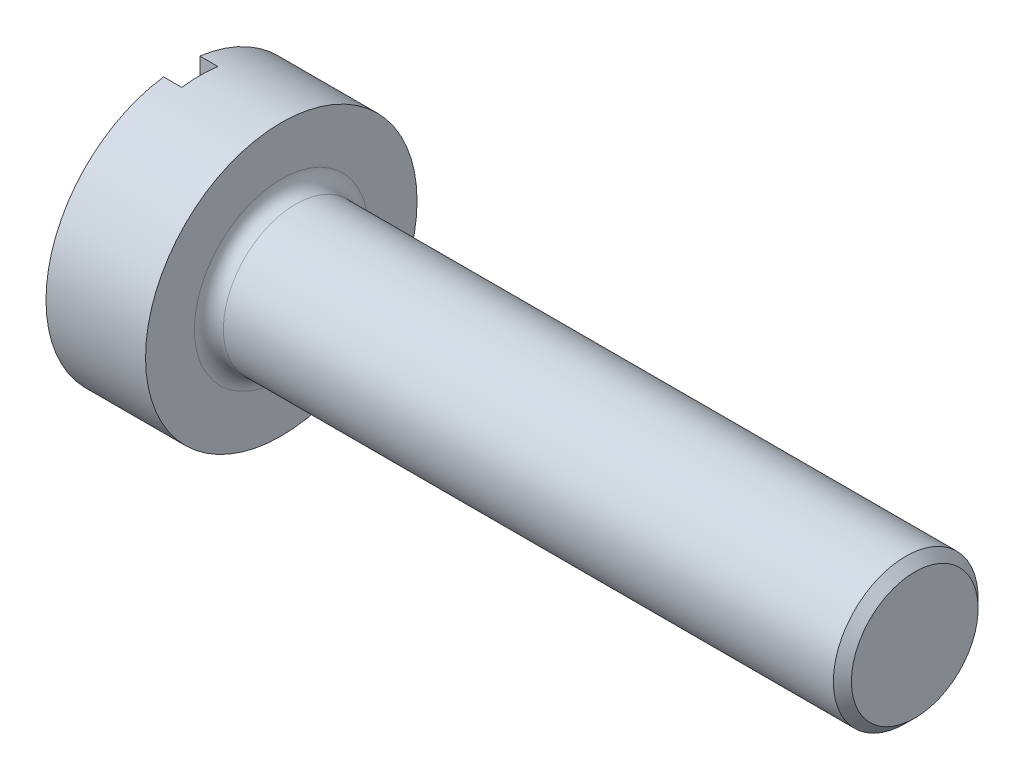
ISO-10303-21;
HEADER;
FILE_DESCRIPTION(('STEP AP214'),'2;1');
FILE_NAME('part.step','',(''),(''),'','','');
FILE_SCHEMA(('AUTOMOTIVE_DESIGN { 1 0 10303 214 1 1 1 1 }'));
ENDSEC;
DATA;
#1=APPLICATION_CONTEXT('core data for automotive mechanical design processes');
#2=APPLICATION_PROTOCOL_DEFINITION('international standard','automotive_design',2000,#1);
#3=PRODUCT_CONTEXT('',#1,'mechanical');
#4=PRODUCT('Part','Part','',(#3));
#5=PRODUCT_RELATED_PRODUCT_CATEGORY('part','',(#4));
#6=PRODUCT_DEFINITION_FORMATION('','',#4);
#7=PRODUCT_DEFINITION_CONTEXT('part definition',#1,'design');
#8=PRODUCT_DEFINITION('design','',#6,#7);
#9=PRODUCT_DEFINITION_SHAPE('','',#8);
#10=(LENGTH_UNIT() NAMED_UNIT(*) SI_UNIT(.MILLI.,.METRE.));
#11=(NAMED_UNIT(*) PLANE_ANGLE_UNIT() SI_UNIT($,.RADIAN.));
#12=(NAMED_UNIT(*) SI_UNIT($,.STERADIAN.) SOLID_ANGLE_UNIT());
#13=UNCERTAINTY_MEASURE_WITH_UNIT(LENGTH_MEASURE(1.E-05),#10,'distance_accuracy_value','');
#14=(GEOMETRIC_REPRESENTATION_CONTEXT(3) GLOBAL_UNCERTAINTY_ASSIGNED_CONTEXT((#13)) GLOBAL_UNIT_ASSIGNED_CONTEXT((#10,
#11,#12)) REPRESENTATION_CONTEXT('',''));
#15=CARTESIAN_POINT('',(0.,0.,0.));
#16=DIRECTION('',(0.,0.,1.));
#17=DIRECTION('',(1.,0.,0.));
#18=AXIS2_PLACEMENT_3D('',#15,#16,#17);
#19=CARTESIAN_POINT('',(0.,0.,0.));
#20=DIRECTION('',(-1.,0.,0.));
#21=DIRECTION('',(0.,0.,1.));
#22=AXIS2_PLACEMENT_3D('',#19,#20,#21);
#23=PLANE('',#22);
#24=CARTESIAN_POINT('',(0.,0.,0.));
#25=DIRECTION('',(-1.,0.,0.));
#26=DIRECTION('',(0.,0.,1.));
#27=AXIS2_PLACEMENT_3D('',#24,#25,#26);
#28=CIRCLE('',#27,1.5);
#29=CARTESIAN_POINT('',(0.,1.48660687473185,-0.2));
#30=VERTEX_POINT('',#29);
#31=CARTESIAN_POINT('',(0.,-1.48660687473185,-0.2));
#32=VERTEX_POINT('',#31);
#33=EDGE_CURVE('E86',#30,#32,#28,.T.);
#34=ORIENTED_EDGE('',*,*,#33,.T.);
#35=DIRECTION('',(0.,1.,0.));
#36=VECTOR('',#35,1.);
#37=CARTESIAN_POINT('',(0.,-1.5,-0.2));
#38=LINE('',#37,#36);
#39=EDGE_CURVE('E52',#32,#30,#38,.T.);
#40=ORIENTED_EDGE('',*,*,#39,.T.);
#41=EDGE_LOOP('',(#34,#40));
#42=FACE_BOUND('',#41,.T.);
#43=ADVANCED_FACE('F37',(#42),#23,.T.);
#44=CARTESIAN_POINT('',(0.,0.,0.));
#45=DIRECTION('',(-1.,0.,0.));
#46=DIRECTION('',(0.,0.,1.));
#47=AXIS2_PLACEMENT_3D('',#44,#45,#46);
#48=CYLINDRICAL_SURFACE('',#47,1.5);
#49=CARTESIAN_POINT('',(1.1,0.,0.));
#50=DIRECTION('',(-1.,0.,0.));
#51=DIRECTION('',(0.,0.,1.));
#52=AXIS2_PLACEMENT_3D('',#49,#50,#51);
#53=CIRCLE('',#52,1.5);
#54=CARTESIAN_POINT('',(1.1,0.,1.5));
#55=VERTEX_POINT('',#54);
#56=EDGE_CURVE('E92',#55,#55,#53,.T.);
#57=ORIENTED_EDGE('',*,*,#56,.T.);
#58=EDGE_LOOP('',(#57));
#59=FACE_BOUND('',#58,.T.);
#60=DIRECTION('',(-1.,0.,0.));
#61=VECTOR('',#60,1.);
#62=CARTESIAN_POINT('',(0.,-1.48660687473185,0.2));
#63=LINE('',#62,#61);
#64=CARTESIAN_POINT('',(0.2,-1.48660687473185,0.2));
#65=VERTEX_POINT('',#64);
#66=CARTESIAN_POINT('',(0.,-1.48660687473185,0.2));
#67=VERTEX_POINT('',#66);
#68=EDGE_CURVE('E11',#65,#67,#63,.T.);
#69=ORIENTED_EDGE('',*,*,#68,.F.);
#70=CARTESIAN_POINT('',(0.2,0.,0.));
#71=DIRECTION('',(-1.,0.,0.));
#72=DIRECTION('',(0.,0.,1.));
#73=AXIS2_PLACEMENT_3D('',#70,#71,#72);
#74=CIRCLE('',#73,1.5);
#75=CARTESIAN_POINT('',(0.2,-1.48660687473185,-0.2));
#76=VERTEX_POINT('',#75);
#77=EDGE_CURVE('E115',#65,#76,#74,.F.);
#78=ORIENTED_EDGE('',*,*,#77,.T.);
#79=DIRECTION('',(-1.,0.,0.));
#80=VECTOR('',#79,1.);
#81=CARTESIAN_POINT('',(0.,-1.48660687473185,-0.2));
#82=LINE('',#81,#80);
#83=EDGE_CURVE('E83',#76,#32,#82,.T.);
#84=ORIENTED_EDGE('',*,*,#83,.T.);
#85=ORIENTED_EDGE('',*,*,#33,.F.);
#86=DIRECTION('',(-1.,0.,0.));
#87=VECTOR('',#86,1.);
#88=CARTESIAN_POINT('',(0.,1.48660687473185,-0.2));
#89=LINE('',#88,#87);
#90=CARTESIAN_POINT('',(0.2,1.48660687473185,-0.2));
#91=VERTEX_POINT('',#90);
#92=EDGE_CURVE('E45',#30,#91,#89,.F.);
#93=ORIENTED_EDGE('',*,*,#92,.T.);
#94=CARTESIAN_POINT('',(0.2,1.48660687473185,0.2));
#95=VERTEX_POINT('',#94);
#96=EDGE_CURVE('E113',#91,#95,#74,.F.);
#97=ORIENTED_EDGE('',*,*,#96,.T.);
#98=DIRECTION('',(-1.,0.,0.));
#99=VECTOR('',#98,1.);
#100=CARTESIAN_POINT('',(0.,1.48660687473185,0.2));
#101=LINE('',#100,#99);
#102=CARTESIAN_POINT('',(0.,1.48660687473185,0.2));
#103=VERTEX_POINT('',#102);
#104=EDGE_CURVE('E60',#103,#95,#101,.F.);
#105=ORIENTED_EDGE('',*,*,#104,.F.);
#106=EDGE_CURVE('E93',#67,#103,#28,.T.);
#107=ORIENTED_EDGE('',*,*,#106,.F.);
#108=EDGE_LOOP('',(#69,#78,#84,#85,#93,#97,#105,#107));
#109=FACE_BOUND('',#108,.T.);
#110=ADVANCED_FACE('F90',(#59,#109),#48,.T.);
#111=DIRECTION('',(0.,1.,0.));
#112=VECTOR('',#111,1.);
#113=CARTESIAN_POINT('',(0.,-1.5,0.2));
#114=LINE('',#113,#112);
#115=EDGE_CURVE('E87',#67,#103,#114,.T.);
#116=ORIENTED_EDGE('',*,*,#115,.F.);
#117=ORIENTED_EDGE('',*,*,#106,.T.);
#118=EDGE_LOOP('',(#116,#117));
#119=FACE_BOUND('',#118,.T.);
#120=ADVANCED_FACE('F125',(#119),#23,.T.);
#121=CARTESIAN_POINT('',(8.1,0.,0.));
#122=DIRECTION('',(-1.,0.,0.));
#123=DIRECTION('',(0.,0.,1.));
#124=AXIS2_PLACEMENT_3D('',#121,#122,#123);
#125=PLANE('',#124);
#126=CARTESIAN_POINT('',(8.1,0.,0.));
#127=DIRECTION('',(-1.,0.,0.));
#128=DIRECTION('',(0.,0.,1.));
#129=AXIS2_PLACEMENT_3D('',#126,#127,#128);
#130=CIRCLE('',#129,0.699999999999998);
#131=CARTESIAN_POINT('',(8.1,0.,0.699999999999998));
#132=VERTEX_POINT('',#131);
#133=EDGE_CURVE('E104',#132,#132,#130,.F.);
#134=ORIENTED_EDGE('',*,*,#133,.T.);
#135=EDGE_LOOP('',(#134));
#136=FACE_BOUND('',#135,.T.);
#137=ADVANCED_FACE('F127',(#136),#125,.F.);
#138=CARTESIAN_POINT('',(0.,0.,0.));
#139=DIRECTION('',(-1.,0.,0.));
#140=DIRECTION('',(0.,0.,1.));
#141=AXIS2_PLACEMENT_3D('',#138,#139,#140);
#142=CYLINDRICAL_SURFACE('',#141,0.800000000000001);
#143=CARTESIAN_POINT('',(1.26,0.,0.));
#144=DIRECTION('',(1.,0.,0.));
#145=DIRECTION('',(0.,0.,-1.));
#146=AXIS2_PLACEMENT_3D('',#143,#144,#145);
#147=CIRCLE('',#146,0.800000000000001);
#148=CARTESIAN_POINT('',(1.26,0.,-0.800000000000001));
#149=VERTEX_POINT('',#148);
#150=EDGE_CURVE('E110',#149,#149,#147,.T.);
#151=ORIENTED_EDGE('',*,*,#150,.T.);
#152=EDGE_LOOP('',(#151));
#153=FACE_BOUND('',#152,.T.);
#154=CARTESIAN_POINT('',(8.,0.,0.));
#155=DIRECTION('',(-1.,0.,0.));
#156=DIRECTION('',(0.,0.,1.));
#157=AXIS2_PLACEMENT_3D('',#154,#155,#156);
#158=CIRCLE('',#157,0.800000000000001);
#159=CARTESIAN_POINT('',(8.,0.,0.800000000000001));
#160=VERTEX_POINT('',#159);
#161=EDGE_CURVE('E96',#160,#160,#158,.T.);
#162=ORIENTED_EDGE('',*,*,#161,.T.);
#163=EDGE_LOOP('',(#162));
#164=FACE_BOUND('',#163,.T.);
#165=ADVANCED_FACE('F133',(#153,#164),#142,.T.);
#166=CARTESIAN_POINT('',(1.1,0.,0.));
#167=DIRECTION('',(1.,0.,0.));
#168=DIRECTION('',(0.,0.,-1.));
#169=AXIS2_PLACEMENT_3D('',#166,#167,#168);
#170=PLANE('',#169);
#171=CARTESIAN_POINT('',(1.1,0.,0.));
#172=DIRECTION('',(1.,0.,0.));
#173=DIRECTION('',(0.,0.,-1.));
#174=AXIS2_PLACEMENT_3D('',#171,#172,#173);
#175=CIRCLE('',#174,0.960000000000001);
#176=CARTESIAN_POINT('',(1.1,0.,-0.960000000000001));
#177=VERTEX_POINT('',#176);
#178=EDGE_CURVE('E107',#177,#177,#175,.F.);
#179=ORIENTED_EDGE('',*,*,#178,.T.);
#180=EDGE_LOOP('',(#179));
#181=FACE_BOUND('',#180,.T.);
#182=ORIENTED_EDGE('',*,*,#56,.F.);
#183=EDGE_LOOP('',(#182));
#184=FACE_BOUND('',#183,.T.);
#185=ADVANCED_FACE('F183',(#181,#184),#170,.T.);
#186=CARTESIAN_POINT('',(8.,0.,0.));
#187=DIRECTION('',(-1.,0.,0.));
#188=DIRECTION('',(0.,0.,1.));
#189=AXIS2_PLACEMENT_3D('',#186,#187,#188);
#190=CONICAL_SURFACE('',#189,0.800000000000001,0.785398163397454);
#191=ORIENTED_EDGE('',*,*,#133,.F.);
#192=EDGE_LOOP('',(#191));
#193=FACE_BOUND('',#192,.T.);
#194=ORIENTED_EDGE('',*,*,#161,.F.);
#195=EDGE_LOOP('',(#194));
#196=FACE_BOUND('',#195,.T.);
#197=ADVANCED_FACE('F186',(#193,#196),#190,.T.);
#198=CARTESIAN_POINT('',(1.26,0.,0.));
#199=DIRECTION('',(1.,0.,0.));
#200=DIRECTION('',(0.,0.,-1.));
#201=AXIS2_PLACEMENT_3D('',#198,#199,#200);
#202=TOROIDAL_SURFACE('',#201,0.960000000000001,0.16);
#203=ORIENTED_EDGE('',*,*,#150,.F.);
#204=EDGE_LOOP('',(#203));
#205=FACE_BOUND('',#204,.T.);
#206=ORIENTED_EDGE('',*,*,#178,.F.);
#207=EDGE_LOOP('',(#206));
#208=FACE_BOUND('',#207,.T.);
#209=ADVANCED_FACE('F39',(#205,#208),#202,.F.);
#210=CARTESIAN_POINT('',(0.2,-1.5,0.));
#211=DIRECTION('',(-1.,0.,0.));
#212=DIRECTION('',(0.,0.,1.));
#213=AXIS2_PLACEMENT_3D('',#210,#211,#212);
#214=PLANE('',#213);
#215=DIRECTION('',(0.,1.,0.));
#216=VECTOR('',#215,1.);
#217=CARTESIAN_POINT('',(0.2,-1.5,0.2));
#218=LINE('',#217,#216);
#219=EDGE_CURVE('E99',#65,#95,#218,.T.);
#220=ORIENTED_EDGE('',*,*,#219,.T.);
#221=ORIENTED_EDGE('',*,*,#96,.F.);
#222=DIRECTION('',(0.,1.,0.));
#223=VECTOR('',#222,1.);
#224=CARTESIAN_POINT('',(0.2,-1.5,-0.2));
#225=LINE('',#224,#223);
#226=EDGE_CURVE('E79',#76,#91,#225,.T.);
#227=ORIENTED_EDGE('',*,*,#226,.F.);
#228=ORIENTED_EDGE('',*,*,#77,.F.);
#229=EDGE_LOOP('',(#220,#221,#227,#228));
#230=FACE_BOUND('',#229,.T.);
#231=ADVANCED_FACE('F119',(#230),#214,.T.);
#232=CARTESIAN_POINT('',(0.,-1.5,0.2));
#233=DIRECTION('',(0.,0.,1.));
#234=DIRECTION('',(1.,0.,0.));
#235=AXIS2_PLACEMENT_3D('',#232,#233,#234);
#236=PLANE('',#235);
#237=ORIENTED_EDGE('',*,*,#104,.T.);
#238=ORIENTED_EDGE('',*,*,#219,.F.);
#239=ORIENTED_EDGE('',*,*,#68,.T.);
#240=ORIENTED_EDGE('',*,*,#115,.T.);
#241=EDGE_LOOP('',(#237,#238,#239,#240));
#242=FACE_BOUND('',#241,.T.);
#243=ADVANCED_FACE('F120',(#242),#236,.F.);
#244=CARTESIAN_POINT('',(0.,-1.5,-0.2));
#245=DIRECTION('',(0.,0.,1.));
#246=DIRECTION('',(1.,0.,0.));
#247=AXIS2_PLACEMENT_3D('',#244,#245,#246);
#248=PLANE('',#247);
#249=ORIENTED_EDGE('',*,*,#39,.F.);
#250=ORIENTED_EDGE('',*,*,#83,.F.);
#251=ORIENTED_EDGE('',*,*,#226,.T.);
#252=ORIENTED_EDGE('',*,*,#92,.F.);
#253=EDGE_LOOP('',(#249,#250,#251,#252));
#254=FACE_BOUND('',#253,.T.);
#255=ADVANCED_FACE('F77',(#254),#248,.T.);
#256=CLOSED_SHELL('',(#43,#110,#120,#137,#165,#185,#197,#209,#231,#243,#255));
#257=MANIFOLD_SOLID_BREP('B2',#256);
#258=ADVANCED_BREP_SHAPE_REPRESENTATION('',(#18,#257),#14);
#259=SHAPE_DEFINITION_REPRESENTATION(#9,#258);
ENDSEC;
END-ISO-10303-21;
